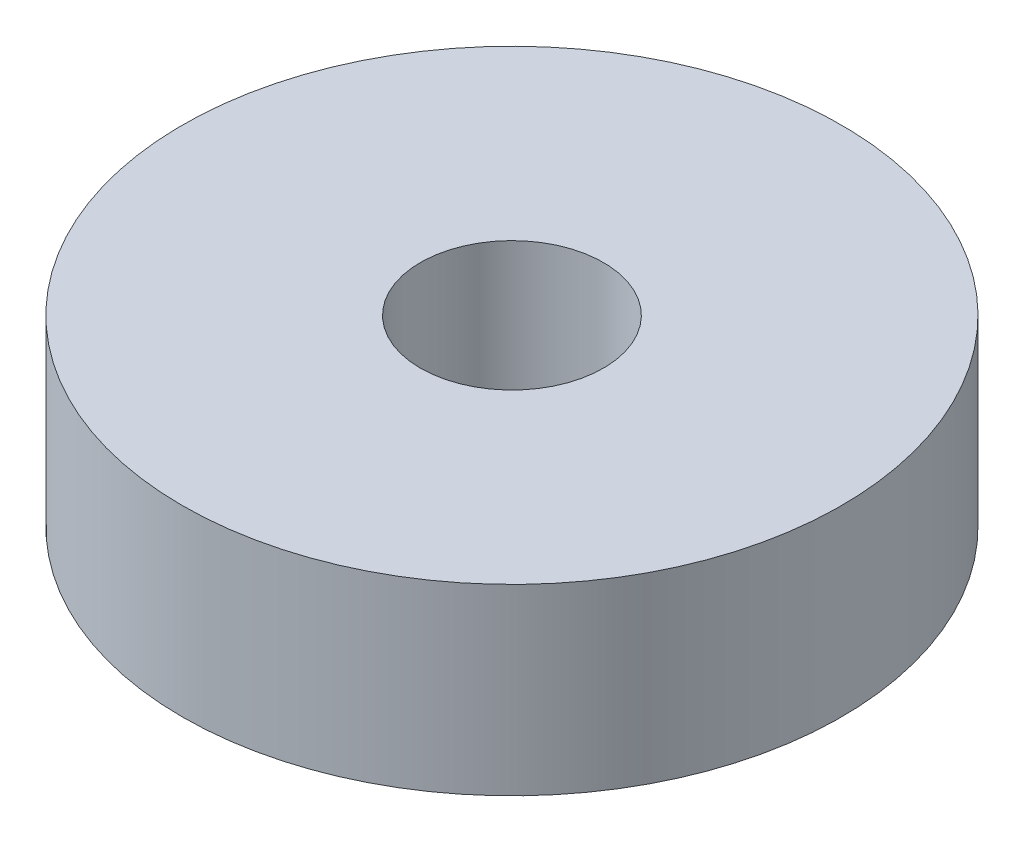
ISO-10303-21;
HEADER;
FILE_DESCRIPTION(('STEP AP214'),'2;1');
FILE_NAME('part.step','',(''),(''),'','','');
FILE_SCHEMA(('AUTOMOTIVE_DESIGN { 1 0 10303 214 1 1 1 1 }'));
ENDSEC;
DATA;
#1=APPLICATION_CONTEXT('core data for automotive mechanical design processes');
#2=APPLICATION_PROTOCOL_DEFINITION('international standard','automotive_design',2000,#1);
#3=PRODUCT_CONTEXT('',#1,'mechanical');
#4=PRODUCT('Part','Part','',(#3));
#5=PRODUCT_RELATED_PRODUCT_CATEGORY('part','',(#4));
#6=PRODUCT_DEFINITION_FORMATION('','',#4);
#7=PRODUCT_DEFINITION_CONTEXT('part definition',#1,'design');
#8=PRODUCT_DEFINITION('design','',#6,#7);
#9=PRODUCT_DEFINITION_SHAPE('','',#8);
#10=(LENGTH_UNIT() NAMED_UNIT(*) SI_UNIT(.MILLI.,.METRE.));
#11=(NAMED_UNIT(*) PLANE_ANGLE_UNIT() SI_UNIT($,.RADIAN.));
#12=(NAMED_UNIT(*) SI_UNIT($,.STERADIAN.) SOLID_ANGLE_UNIT());
#13=UNCERTAINTY_MEASURE_WITH_UNIT(LENGTH_MEASURE(1.E-05),#10,'distance_accuracy_value','');
#14=(GEOMETRIC_REPRESENTATION_CONTEXT(3) GLOBAL_UNCERTAINTY_ASSIGNED_CONTEXT((#13)) GLOBAL_UNIT_ASSIGNED_CONTEXT((#10,
#11,#12)) REPRESENTATION_CONTEXT('',''));
#15=CARTESIAN_POINT('',(0.,0.,0.));
#16=DIRECTION('',(0.,0.,1.));
#17=DIRECTION('',(1.,0.,0.));
#18=AXIS2_PLACEMENT_3D('',#15,#16,#17);
#19=CARTESIAN_POINT('',(0.,5.,0.));
#20=DIRECTION('',(0.,1.,0.));
#21=DIRECTION('',(0.,0.,1.));
#22=AXIS2_PLACEMENT_3D('',#19,#20,#21);
#23=PLANE('',#22);
#24=CARTESIAN_POINT('',(0.,5.,0.));
#25=DIRECTION('',(0.,1.,0.));
#26=DIRECTION('',(0.,0.,1.));
#27=AXIS2_PLACEMENT_3D('',#24,#25,#26);
#28=CIRCLE('',#27,9.);
#29=CARTESIAN_POINT('',(0.,5.,9.));
#30=VERTEX_POINT('',#29);
#31=EDGE_CURVE('E10',#30,#30,#28,.T.);
#32=ORIENTED_EDGE('',*,*,#31,.T.);
#33=EDGE_LOOP('',(#32));
#34=FACE_BOUND('',#33,.T.);
#35=CARTESIAN_POINT('',(0.,5.,0.));
#36=DIRECTION('',(0.,1.,0.));
#37=DIRECTION('',(0.,0.,1.));
#38=AXIS2_PLACEMENT_3D('',#35,#36,#37);
#39=CIRCLE('',#38,2.5);
#40=CARTESIAN_POINT('',(0.,5.,2.5));
#41=VERTEX_POINT('',#40);
#42=EDGE_CURVE('E42',#41,#41,#39,.T.);
#43=ORIENTED_EDGE('',*,*,#42,.F.);
#44=EDGE_LOOP('',(#43));
#45=FACE_BOUND('',#44,.T.);
#46=ADVANCED_FACE('F31',(#34,#45),#23,.T.);
#47=CARTESIAN_POINT('',(0.,0.,0.));
#48=DIRECTION('',(0.,1.,0.));
#49=DIRECTION('',(0.,0.,1.));
#50=AXIS2_PLACEMENT_3D('',#47,#48,#49);
#51=PLANE('',#50);
#52=CARTESIAN_POINT('',(0.,0.,0.));
#53=DIRECTION('',(0.,1.,0.));
#54=DIRECTION('',(0.,0.,1.));
#55=AXIS2_PLACEMENT_3D('',#52,#53,#54);
#56=CIRCLE('',#55,9.);
#57=CARTESIAN_POINT('',(0.,0.,9.));
#58=VERTEX_POINT('',#57);
#59=EDGE_CURVE('E35',#58,#58,#56,.T.);
#60=ORIENTED_EDGE('',*,*,#59,.F.);
#61=EDGE_LOOP('',(#60));
#62=FACE_BOUND('',#61,.T.);
#63=CARTESIAN_POINT('',(0.,0.,0.));
#64=DIRECTION('',(0.,1.,0.));
#65=DIRECTION('',(0.,0.,1.));
#66=AXIS2_PLACEMENT_3D('',#63,#64,#65);
#67=CIRCLE('',#66,2.5);
#68=CARTESIAN_POINT('',(0.,0.,2.5));
#69=VERTEX_POINT('',#68);
#70=EDGE_CURVE('E44',#69,#69,#67,.T.);
#71=ORIENTED_EDGE('',*,*,#70,.T.);
#72=EDGE_LOOP('',(#71));
#73=FACE_BOUND('',#72,.T.);
#74=ADVANCED_FACE('F54',(#62,#73),#51,.F.);
#75=CARTESIAN_POINT('',(0.,5.,0.));
#76=DIRECTION('',(0.,-1.,0.));
#77=DIRECTION('',(0.,0.,-1.));
#78=AXIS2_PLACEMENT_3D('',#75,#76,#77);
#79=CYLINDRICAL_SURFACE('',#78,9.);
#80=ORIENTED_EDGE('',*,*,#31,.F.);
#81=EDGE_LOOP('',(#80));
#82=FACE_BOUND('',#81,.T.);
#83=ORIENTED_EDGE('',*,*,#59,.T.);
#84=EDGE_LOOP('',(#83));
#85=FACE_BOUND('',#84,.T.);
#86=ADVANCED_FACE('F33',(#82,#85),#79,.T.);
#87=CARTESIAN_POINT('',(0.,5.,0.));
#88=DIRECTION('',(0.,-1.,0.));
#89=DIRECTION('',(0.,0.,-1.));
#90=AXIS2_PLACEMENT_3D('',#87,#88,#89);
#91=CYLINDRICAL_SURFACE('',#90,2.5);
#92=ORIENTED_EDGE('',*,*,#42,.T.);
#93=EDGE_LOOP('',(#92));
#94=FACE_BOUND('',#93,.T.);
#95=ORIENTED_EDGE('',*,*,#70,.F.);
#96=EDGE_LOOP('',(#95));
#97=FACE_BOUND('',#96,.T.);
#98=ADVANCED_FACE('F50',(#94,#97),#91,.F.);
#99=CLOSED_SHELL('',(#46,#74,#86,#98));
#100=MANIFOLD_SOLID_BREP('B2',#99);
#101=ADVANCED_BREP_SHAPE_REPRESENTATION('',(#18,#100),#14);
#102=SHAPE_DEFINITION_REPRESENTATION(#9,#101);
ENDSEC;
END-ISO-10303-21;
